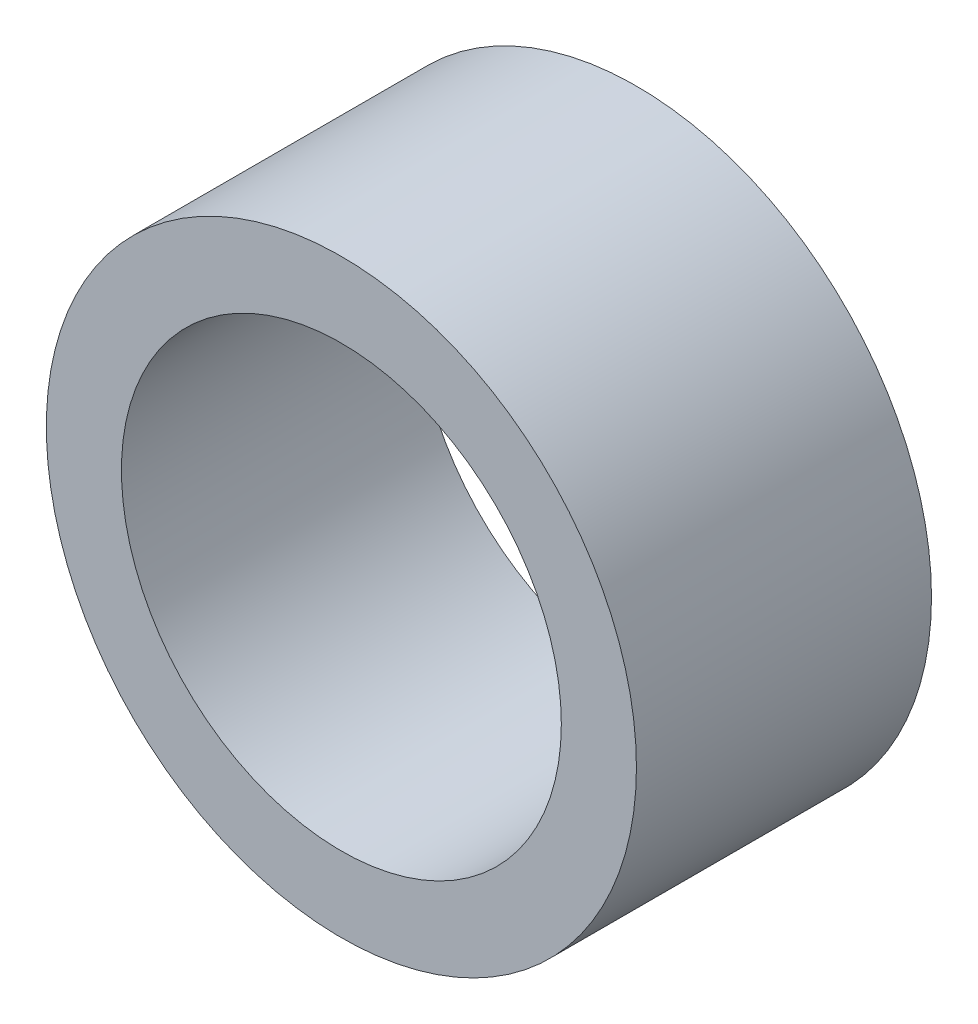
ISO-10303-21;
HEADER;
FILE_DESCRIPTION(('STEP AP214'),'2;1');
FILE_NAME('part.step','',(''),(''),'','','');
FILE_SCHEMA(('AUTOMOTIVE_DESIGN { 1 0 10303 214 1 1 1 1 }'));
ENDSEC;
DATA;
#1=APPLICATION_CONTEXT('core data for automotive mechanical design processes');
#2=APPLICATION_PROTOCOL_DEFINITION('international standard','automotive_design',2000,#1);
#3=PRODUCT_CONTEXT('',#1,'mechanical');
#4=PRODUCT('Part','Part','',(#3));
#5=PRODUCT_RELATED_PRODUCT_CATEGORY('part','',(#4));
#6=PRODUCT_DEFINITION_FORMATION('','',#4);
#7=PRODUCT_DEFINITION_CONTEXT('part definition',#1,'design');
#8=PRODUCT_DEFINITION('design','',#6,#7);
#9=PRODUCT_DEFINITION_SHAPE('','',#8);
#10=(LENGTH_UNIT() NAMED_UNIT(*) SI_UNIT(.MILLI.,.METRE.));
#11=(NAMED_UNIT(*) PLANE_ANGLE_UNIT() SI_UNIT($,.RADIAN.));
#12=(NAMED_UNIT(*) SI_UNIT($,.STERADIAN.) SOLID_ANGLE_UNIT());
#13=UNCERTAINTY_MEASURE_WITH_UNIT(LENGTH_MEASURE(1.E-05),#10,'distance_accuracy_value','');
#14=(GEOMETRIC_REPRESENTATION_CONTEXT(3) GLOBAL_UNCERTAINTY_ASSIGNED_CONTEXT((#13)) GLOBAL_UNIT_ASSIGNED_CONTEXT((#10,
#11,#12)) REPRESENTATION_CONTEXT('',''));
#15=CARTESIAN_POINT('',(0.,0.,0.));
#16=DIRECTION('',(0.,0.,1.));
#17=DIRECTION('',(1.,0.,0.));
#18=AXIS2_PLACEMENT_3D('',#15,#16,#17);
#19=CARTESIAN_POINT('',(0.,0.,5.5));
#20=DIRECTION('',(0.,0.,1.));
#21=DIRECTION('',(1.,0.,0.));
#22=AXIS2_PLACEMENT_3D('',#19,#20,#21);
#23=PLANE('',#22);
#24=CARTESIAN_POINT('',(0.,0.,5.5));
#25=DIRECTION('',(0.,0.,1.));
#26=DIRECTION('',(1.,0.,0.));
#27=AXIS2_PLACEMENT_3D('',#24,#25,#26);
#28=CIRCLE('',#27,5.5);
#29=CARTESIAN_POINT('',(5.5,0.,5.5));
#30=VERTEX_POINT('',#29);
#31=EDGE_CURVE('E10',#30,#30,#28,.T.);
#32=ORIENTED_EDGE('',*,*,#31,.T.);
#33=EDGE_LOOP('',(#32));
#34=FACE_BOUND('',#33,.T.);
#35=CARTESIAN_POINT('',(0.,0.,5.5));
#36=DIRECTION('',(0.,0.,1.));
#37=DIRECTION('',(1.,0.,0.));
#38=AXIS2_PLACEMENT_3D('',#35,#36,#37);
#39=CIRCLE('',#38,4.1);
#40=CARTESIAN_POINT('',(4.1,0.,5.5));
#41=VERTEX_POINT('',#40);
#42=EDGE_CURVE('E56',#41,#41,#39,.T.);
#43=ORIENTED_EDGE('',*,*,#42,.F.);
#44=EDGE_LOOP('',(#43));
#45=FACE_BOUND('',#44,.T.);
#46=ADVANCED_FACE('F43',(#34,#45),#23,.T.);
#47=CARTESIAN_POINT('',(0.,0.,0.));
#48=DIRECTION('',(0.,0.,1.));
#49=DIRECTION('',(1.,0.,0.));
#50=AXIS2_PLACEMENT_3D('',#47,#48,#49);
#51=PLANE('',#50);
#52=CARTESIAN_POINT('',(0.,0.,0.));
#53=DIRECTION('',(0.,0.,1.));
#54=DIRECTION('',(1.,0.,0.));
#55=AXIS2_PLACEMENT_3D('',#52,#53,#54);
#56=CIRCLE('',#55,5.5);
#57=CARTESIAN_POINT('',(5.5,0.,0.));
#58=VERTEX_POINT('',#57);
#59=EDGE_CURVE('E47',#58,#58,#56,.T.);
#60=ORIENTED_EDGE('',*,*,#59,.F.);
#61=EDGE_LOOP('',(#60));
#62=FACE_BOUND('',#61,.T.);
#63=CARTESIAN_POINT('',(0.,0.,0.));
#64=DIRECTION('',(0.,0.,1.));
#65=DIRECTION('',(1.,0.,0.));
#66=AXIS2_PLACEMENT_3D('',#63,#64,#65);
#67=CIRCLE('',#66,4.1);
#68=CARTESIAN_POINT('',(4.1,0.,0.));
#69=VERTEX_POINT('',#68);
#70=EDGE_CURVE('E58',#69,#69,#67,.T.);
#71=ORIENTED_EDGE('',*,*,#70,.T.);
#72=EDGE_LOOP('',(#71));
#73=FACE_BOUND('',#72,.T.);
#74=ADVANCED_FACE('F70',(#62,#73),#51,.F.);
#75=CARTESIAN_POINT('',(0.,0.,5.5));
#76=DIRECTION('',(0.,0.,-1.));
#77=DIRECTION('',(-1.,0.,0.));
#78=AXIS2_PLACEMENT_3D('',#75,#76,#77);
#79=CYLINDRICAL_SURFACE('',#78,5.5);
#80=ORIENTED_EDGE('',*,*,#31,.F.);
#81=EDGE_LOOP('',(#80));
#82=FACE_BOUND('',#81,.T.);
#83=ORIENTED_EDGE('',*,*,#59,.T.);
#84=EDGE_LOOP('',(#83));
#85=FACE_BOUND('',#84,.T.);
#86=ADVANCED_FACE('F45',(#82,#85),#79,.T.);
#87=CARTESIAN_POINT('',(0.,0.,5.5));
#88=DIRECTION('',(0.,0.,-1.));
#89=DIRECTION('',(-1.,0.,0.));
#90=AXIS2_PLACEMENT_3D('',#87,#88,#89);
#91=CYLINDRICAL_SURFACE('',#90,4.1);
#92=ORIENTED_EDGE('',*,*,#42,.T.);
#93=EDGE_LOOP('',(#92));
#94=FACE_BOUND('',#93,.T.);
#95=ORIENTED_EDGE('',*,*,#70,.F.);
#96=EDGE_LOOP('',(#95));
#97=FACE_BOUND('',#96,.T.);
#98=ADVANCED_FACE('F66',(#94,#97),#91,.F.);
#99=CLOSED_SHELL('',(#46,#74,#86,#98));
#100=MANIFOLD_SOLID_BREP('B2',#99);
#101=ADVANCED_BREP_SHAPE_REPRESENTATION('',(#18,#100),#14);
#102=SHAPE_DEFINITION_REPRESENTATION(#9,#101);
ENDSEC;
END-ISO-10303-21;
